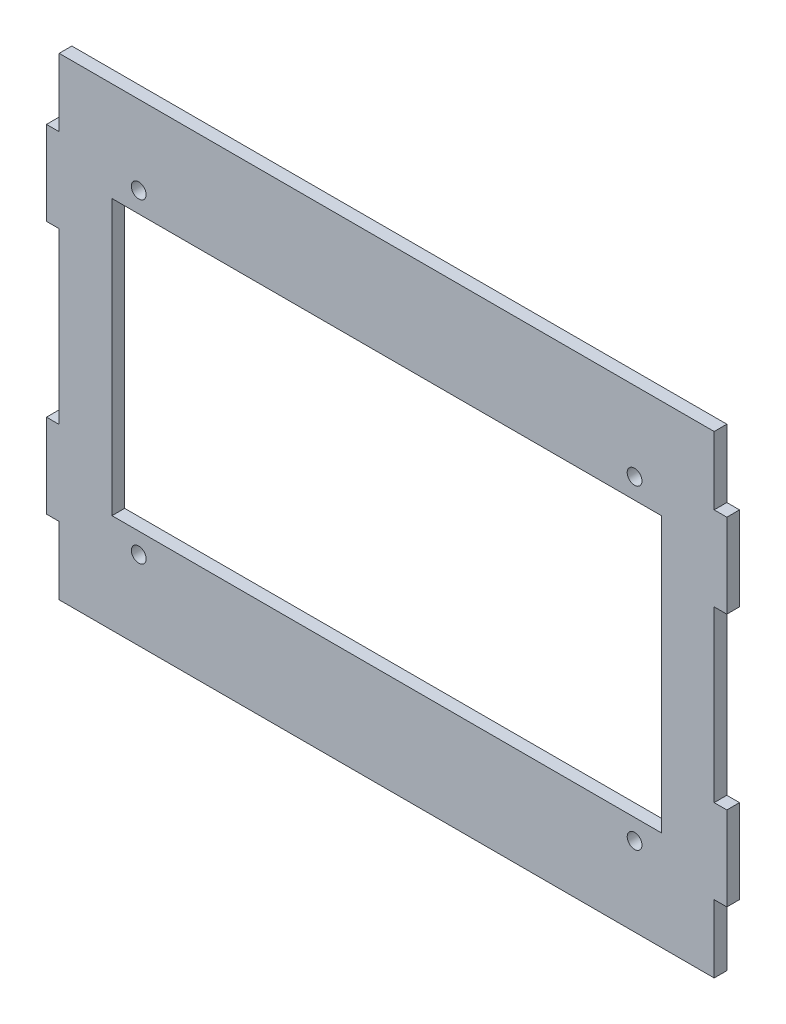
ISO-10303-21;
HEADER;
FILE_DESCRIPTION(('STEP AP214'),'2;1');
FILE_NAME('part.step','',(''),(''),'','','');
FILE_SCHEMA(('AUTOMOTIVE_DESIGN { 1 0 10303 214 1 1 1 1 }'));
ENDSEC;
DATA;
#1=APPLICATION_CONTEXT('core data for automotive mechanical design processes');
#2=APPLICATION_PROTOCOL_DEFINITION('international standard','automotive_design',2000,#1);
#3=PRODUCT_CONTEXT('',#1,'mechanical');
#4=PRODUCT('Part','Part','',(#3));
#5=PRODUCT_RELATED_PRODUCT_CATEGORY('part','',(#4));
#6=PRODUCT_DEFINITION_FORMATION('','',#4);
#7=PRODUCT_DEFINITION_CONTEXT('part definition',#1,'design');
#8=PRODUCT_DEFINITION('design','',#6,#7);
#9=PRODUCT_DEFINITION_SHAPE('','',#8);
#10=(LENGTH_UNIT() NAMED_UNIT(*) SI_UNIT(.MILLI.,.METRE.));
#11=(NAMED_UNIT(*) PLANE_ANGLE_UNIT() SI_UNIT($,.RADIAN.));
#12=(NAMED_UNIT(*) SI_UNIT($,.STERADIAN.) SOLID_ANGLE_UNIT());
#13=UNCERTAINTY_MEASURE_WITH_UNIT(LENGTH_MEASURE(1.E-05),#10,'distance_accuracy_value','');
#14=(GEOMETRIC_REPRESENTATION_CONTEXT(3) GLOBAL_UNCERTAINTY_ASSIGNED_CONTEXT((#13)) GLOBAL_UNIT_ASSIGNED_CONTEXT((#10,
#11,#12)) REPRESENTATION_CONTEXT('',''));
#15=CARTESIAN_POINT('',(0.,0.,0.));
#16=DIRECTION('',(0.,0.,1.));
#17=DIRECTION('',(1.,0.,0.));
#18=AXIS2_PLACEMENT_3D('',#15,#16,#17);
#19=CARTESIAN_POINT('',(139.990197314584,802.917760239699,3.));
#20=DIRECTION('',(1.,0.,0.));
#21=DIRECTION('',(0.,1.,0.));
#22=AXIS2_PLACEMENT_3D('',#19,#20,#21);
#23=PLANE('',#22);
#24=DIRECTION('',(0.,0.,-1.));
#25=VECTOR('',#24,1.);
#26=CARTESIAN_POINT('',(139.990197314584,786.857760239696,3.));
#27=LINE('',#26,#25);
#28=CARTESIAN_POINT('',(139.990197314584,786.857760239696,3.));
#29=VERTEX_POINT('',#28);
#30=CARTESIAN_POINT('',(139.990197314584,786.857760239696,0.));
#31=VERTEX_POINT('',#30);
#32=EDGE_CURVE('E56',#29,#31,#27,.T.);
#33=ORIENTED_EDGE('',*,*,#32,.F.);
#34=DIRECTION('',(0.,-1.,0.));
#35=VECTOR('',#34,1.);
#36=CARTESIAN_POINT('',(139.990197314584,802.917760239699,3.));
#37=LINE('',#36,#35);
#38=CARTESIAN_POINT('',(139.990197314584,802.917760239699,3.));
#39=VERTEX_POINT('',#38);
#40=EDGE_CURVE('E41',#39,#29,#37,.T.);
#41=ORIENTED_EDGE('',*,*,#40,.F.);
#42=DIRECTION('',(0.,0.,-1.));
#43=VECTOR('',#42,1.);
#44=CARTESIAN_POINT('',(139.990197314584,802.917760239699,3.));
#45=LINE('',#44,#43);
#46=CARTESIAN_POINT('',(139.990197314584,802.917760239699,0.));
#47=VERTEX_POINT('',#46);
#48=EDGE_CURVE('E11',#39,#47,#45,.T.);
#49=ORIENTED_EDGE('',*,*,#48,.T.);
#50=DIRECTION('',(0.,-1.,0.));
#51=VECTOR('',#50,1.);
#52=CARTESIAN_POINT('',(139.990197314584,802.917760239699,0.));
#53=LINE('',#52,#51);
#54=EDGE_CURVE('E398',#47,#31,#53,.T.);
#55=ORIENTED_EDGE('',*,*,#54,.T.);
#56=EDGE_LOOP('',(#33,#41,#49,#55));
#57=FACE_BOUND('',#56,.T.);
#58=ADVANCED_FACE('F33',(#57),#23,.F.);
#59=CARTESIAN_POINT('',(139.990197314584,766.977760239696,0.));
#60=VERTEX_POINT('',#59);
#61=CARTESIAN_POINT('',(139.990197314585,726.857760239702,0.));
#62=VERTEX_POINT('',#61);
#63=EDGE_CURVE('E400',#60,#62,#53,.T.);
#64=ORIENTED_EDGE('',*,*,#63,.T.);
#65=DIRECTION('',(0.,0.,-1.));
#66=VECTOR('',#65,1.);
#67=CARTESIAN_POINT('',(139.990197314585,726.857760239702,3.));
#68=LINE('',#67,#66);
#69=CARTESIAN_POINT('',(139.990197314585,726.857760239702,3.));
#70=VERTEX_POINT('',#69);
#71=EDGE_CURVE('E267',#70,#62,#68,.T.);
#72=ORIENTED_EDGE('',*,*,#71,.F.);
#73=CARTESIAN_POINT('',(139.990197314584,766.977760239696,3.));
#74=VERTEX_POINT('',#73);
#75=EDGE_CURVE('E48',#74,#70,#37,.T.);
#76=ORIENTED_EDGE('',*,*,#75,.F.);
#77=DIRECTION('',(0.,0.,-1.));
#78=VECTOR('',#77,1.);
#79=CARTESIAN_POINT('',(139.990197314584,766.977760239696,3.));
#80=LINE('',#79,#78);
#81=EDGE_CURVE('E370',#74,#60,#80,.T.);
#82=ORIENTED_EDGE('',*,*,#81,.T.);
#83=EDGE_LOOP('',(#64,#72,#76,#82));
#84=FACE_BOUND('',#83,.T.);
#85=ADVANCED_FACE('F403',(#84),#23,.F.);
#86=CARTESIAN_POINT('',(-746.152134466741,375.855698627133,3.));
#87=DIRECTION('',(0.,0.,-1.));
#88=DIRECTION('',(-0.866025403784439,0.499999999999999,0.));
#89=AXIS2_PLACEMENT_3D('',#86,#87,#88);
#90=PLANE('',#89);
#91=ORIENTED_EDGE('',*,*,#75,.T.);
#92=DIRECTION('',(1.,0.,0.));
#93=VECTOR('',#92,1.);
#94=CARTESIAN_POINT('',(136.990197314584,726.857760239702,3.));
#95=LINE('',#94,#93);
#96=CARTESIAN_POINT('',(136.990197314584,726.857760239702,3.));
#97=VERTEX_POINT('',#96);
#98=EDGE_CURVE('E264',#97,#70,#95,.T.);
#99=ORIENTED_EDGE('',*,*,#98,.F.);
#100=DIRECTION('',(0.,1.,0.));
#101=VECTOR('',#100,1.);
#102=CARTESIAN_POINT('',(136.990197314585,706.977760239702,3.));
#103=LINE('',#102,#101);
#104=CARTESIAN_POINT('',(136.990197314585,706.977760239702,3.));
#105=VERTEX_POINT('',#104);
#106=EDGE_CURVE('E260',#105,#97,#103,.T.);
#107=ORIENTED_EDGE('',*,*,#106,.F.);
#108=DIRECTION('',(-1.,0.,0.));
#109=VECTOR('',#108,1.);
#110=CARTESIAN_POINT('',(139.990197314585,706.977760239702,3.));
#111=LINE('',#110,#109);
#112=CARTESIAN_POINT('',(139.990197314585,706.977760239702,3.));
#113=VERTEX_POINT('',#112);
#114=EDGE_CURVE('E257',#113,#105,#111,.T.);
#115=ORIENTED_EDGE('',*,*,#114,.F.);
#116=DIRECTION('',(0.,1.,0.));
#117=VECTOR('',#116,1.);
#118=CARTESIAN_POINT('',(139.990197314585,690.917760239699,3.));
#119=LINE('',#118,#117);
#120=CARTESIAN_POINT('',(139.990197314585,690.917760239699,3.));
#121=VERTEX_POINT('',#120);
#122=EDGE_CURVE('E296',#121,#113,#119,.T.);
#123=ORIENTED_EDGE('',*,*,#122,.F.);
#124=DIRECTION('',(-1.,0.,0.));
#125=VECTOR('',#124,1.);
#126=CARTESIAN_POINT('',(139.990197314585,690.917760239699,3.));
#127=LINE('',#126,#125);
#128=CARTESIAN_POINT('',(294.990197314585,690.917760239699,3.));
#129=VERTEX_POINT('',#128);
#130=EDGE_CURVE('E294',#129,#121,#127,.T.);
#131=ORIENTED_EDGE('',*,*,#130,.F.);
#132=DIRECTION('',(0.,1.,0.));
#133=VECTOR('',#132,1.);
#134=CARTESIAN_POINT('',(294.990197314585,690.917760239699,3.));
#135=LINE('',#134,#133);
#136=CARTESIAN_POINT('',(294.990197314585,706.977760239702,3.));
#137=VERTEX_POINT('',#136);
#138=EDGE_CURVE('E222',#129,#137,#135,.T.);
#139=ORIENTED_EDGE('',*,*,#138,.T.);
#140=DIRECTION('',(1.,0.,0.));
#141=VECTOR('',#140,1.);
#142=CARTESIAN_POINT('',(294.990197314585,706.977760239702,3.));
#143=LINE('',#142,#141);
#144=CARTESIAN_POINT('',(297.990197314584,706.977760239702,3.));
#145=VERTEX_POINT('',#144);
#146=EDGE_CURVE('E200',#137,#145,#143,.T.);
#147=ORIENTED_EDGE('',*,*,#146,.T.);
#148=DIRECTION('',(0.,1.,0.));
#149=VECTOR('',#148,1.);
#150=CARTESIAN_POINT('',(297.990197314584,706.977760239702,3.));
#151=LINE('',#150,#149);
#152=CARTESIAN_POINT('',(297.990197314584,726.857760239702,3.));
#153=VERTEX_POINT('',#152);
#154=EDGE_CURVE('E211',#145,#153,#151,.T.);
#155=ORIENTED_EDGE('',*,*,#154,.T.);
#156=DIRECTION('',(-1.,0.,0.));
#157=VECTOR('',#156,1.);
#158=CARTESIAN_POINT('',(297.990197314584,726.857760239702,3.));
#159=LINE('',#158,#157);
#160=CARTESIAN_POINT('',(294.990197314585,726.857760239703,3.));
#161=VERTEX_POINT('',#160);
#162=EDGE_CURVE('E216',#153,#161,#159,.T.);
#163=ORIENTED_EDGE('',*,*,#162,.T.);
#164=DIRECTION('',(0.,-1.,0.));
#165=VECTOR('',#164,1.);
#166=CARTESIAN_POINT('',(294.990197314584,802.9177602397,3.));
#167=LINE('',#166,#165);
#168=CARTESIAN_POINT('',(294.990197314584,766.977760239696,3.));
#169=VERTEX_POINT('',#168);
#170=EDGE_CURVE('E350',#169,#161,#167,.T.);
#171=ORIENTED_EDGE('',*,*,#170,.F.);
#172=DIRECTION('',(-1.,0.,0.));
#173=VECTOR('',#172,1.);
#174=CARTESIAN_POINT('',(297.990197314584,766.977760239697,3.));
#175=LINE('',#174,#173);
#176=CARTESIAN_POINT('',(297.990197314584,766.977760239697,3.));
#177=VERTEX_POINT('',#176);
#178=EDGE_CURVE('E320',#177,#169,#175,.T.);
#179=ORIENTED_EDGE('',*,*,#178,.F.);
#180=DIRECTION('',(0.,-1.,0.));
#181=VECTOR('',#180,1.);
#182=CARTESIAN_POINT('',(297.990197314584,786.857760239697,3.));
#183=LINE('',#182,#181);
#184=CARTESIAN_POINT('',(297.990197314584,786.857760239697,3.));
#185=VERTEX_POINT('',#184);
#186=EDGE_CURVE('E316',#185,#177,#183,.T.);
#187=ORIENTED_EDGE('',*,*,#186,.F.);
#188=DIRECTION('',(1.,0.,0.));
#189=VECTOR('',#188,1.);
#190=CARTESIAN_POINT('',(294.990197314584,786.857760239697,3.));
#191=LINE('',#190,#189);
#192=CARTESIAN_POINT('',(294.990197314584,786.857760239697,3.));
#193=VERTEX_POINT('',#192);
#194=EDGE_CURVE('E313',#193,#185,#191,.T.);
#195=ORIENTED_EDGE('',*,*,#194,.F.);
#196=CARTESIAN_POINT('',(294.990197314584,802.9177602397,3.));
#197=VERTEX_POINT('',#196);
#198=EDGE_CURVE('E346',#197,#193,#167,.T.);
#199=ORIENTED_EDGE('',*,*,#198,.F.);
#200=DIRECTION('',(-1.,0.,0.));
#201=VECTOR('',#200,1.);
#202=CARTESIAN_POINT('',(139.990197314584,802.917760239699,3.));
#203=LINE('',#202,#201);
#204=EDGE_CURVE('E396',#197,#39,#203,.T.);
#205=ORIENTED_EDGE('',*,*,#204,.T.);
#206=ORIENTED_EDGE('',*,*,#40,.T.);
#207=DIRECTION('',(-1.,0.,0.));
#208=VECTOR('',#207,1.);
#209=CARTESIAN_POINT('',(139.990197314584,786.857760239696,3.));
#210=LINE('',#209,#208);
#211=CARTESIAN_POINT('',(136.990197314584,786.857760239696,3.));
#212=VERTEX_POINT('',#211);
#213=EDGE_CURVE('E363',#29,#212,#210,.T.);
#214=ORIENTED_EDGE('',*,*,#213,.T.);
#215=DIRECTION('',(0.,-1.,0.));
#216=VECTOR('',#215,1.);
#217=CARTESIAN_POINT('',(136.990197314584,786.857760239696,3.));
#218=LINE('',#217,#216);
#219=CARTESIAN_POINT('',(136.990197314584,766.977760239696,3.));
#220=VERTEX_POINT('',#219);
#221=EDGE_CURVE('E365',#212,#220,#218,.T.);
#222=ORIENTED_EDGE('',*,*,#221,.T.);
#223=DIRECTION('',(1.,0.,0.));
#224=VECTOR('',#223,1.);
#225=CARTESIAN_POINT('',(136.990197314584,766.977760239696,3.));
#226=LINE('',#225,#224);
#227=EDGE_CURVE('E368',#220,#74,#226,.T.);
#228=ORIENTED_EDGE('',*,*,#227,.T.);
#229=EDGE_LOOP('',(#91,#99,#107,#115,#123,#131,#139,#147,#155,#163,#171,#179,#187,#195,#199,
#205,#206,#214,#222,#228));
#230=FACE_BOUND('',#229,.T.);
#231=CARTESIAN_POINT('',(158.820197314584,784.232760239699,3.));
#232=DIRECTION('',(0.,0.,1.));
#233=DIRECTION('',(0.866025403784439,-0.499999999999999,0.));
#234=AXIS2_PLACEMENT_3D('',#231,#232,#233);
#235=CIRCLE('',#234,1.75);
#236=CARTESIAN_POINT('',(160.335741771207,783.357760239699,3.));
#237=VERTEX_POINT('',#236);
#238=EDGE_CURVE('E356',#237,#237,#235,.T.);
#239=ORIENTED_EDGE('',*,*,#238,.F.);
#240=EDGE_LOOP('',(#239));
#241=FACE_BOUND('',#240,.T.);
#242=DIRECTION('',(-1.,0.,0.));
#243=VECTOR('',#242,1.);
#244=CARTESIAN_POINT('',(152.490197314585,714.417760239699,3.));
#245=LINE('',#244,#243);
#246=CARTESIAN_POINT('',(282.490197314584,714.417760239699,3.));
#247=VERTEX_POINT('',#246);
#248=CARTESIAN_POINT('',(152.490197314585,714.417760239699,3.));
#249=VERTEX_POINT('',#248);
#250=EDGE_CURVE('E285',#247,#249,#245,.T.);
#251=ORIENTED_EDGE('',*,*,#250,.T.);
#252=DIRECTION('',(0.,-1.,0.));
#253=VECTOR('',#252,1.);
#254=CARTESIAN_POINT('',(152.490197314584,714.417760239699,3.));
#255=LINE('',#254,#253);
#256=CARTESIAN_POINT('',(152.490197314584,779.417760239699,3.));
#257=VERTEX_POINT('',#256);
#258=EDGE_CURVE('E387',#257,#249,#255,.T.);
#259=ORIENTED_EDGE('',*,*,#258,.F.);
#260=DIRECTION('',(-1.,0.,0.));
#261=VECTOR('',#260,1.);
#262=CARTESIAN_POINT('',(152.490197314584,779.417760239699,3.));
#263=LINE('',#262,#261);
#264=CARTESIAN_POINT('',(282.490197314584,779.4177602397,3.));
#265=VERTEX_POINT('',#264);
#266=EDGE_CURVE('E385',#265,#257,#263,.T.);
#267=ORIENTED_EDGE('',*,*,#266,.F.);
#268=DIRECTION('',(0.,-1.,0.));
#269=VECTOR('',#268,1.);
#270=CARTESIAN_POINT('',(282.490197314584,714.417760239699,3.));
#271=LINE('',#270,#269);
#272=EDGE_CURVE('E339',#265,#247,#271,.T.);
#273=ORIENTED_EDGE('',*,*,#272,.T.);
#274=EDGE_LOOP('',(#251,#259,#267,#273));
#275=FACE_BOUND('',#274,.T.);
#276=CARTESIAN_POINT('',(276.160197314584,784.232760239699,3.));
#277=DIRECTION('',(0.,0.,-1.));
#278=DIRECTION('',(-0.866025403784438,-0.500000000000002,0.));
#279=AXIS2_PLACEMENT_3D('',#276,#277,#278);
#280=CIRCLE('',#279,1.75);
#281=CARTESIAN_POINT('',(274.644652857961,783.357760239699,3.));
#282=VERTEX_POINT('',#281);
#283=EDGE_CURVE('E306',#282,#282,#280,.T.);
#284=ORIENTED_EDGE('',*,*,#283,.T.);
#285=EDGE_LOOP('',(#284));
#286=FACE_BOUND('',#285,.T.);
#287=CARTESIAN_POINT('',(158.820197314584,709.602760239699,3.));
#288=DIRECTION('',(0.,0.,-1.));
#289=DIRECTION('',(0.866025403784437,0.500000000000004,0.));
#290=AXIS2_PLACEMENT_3D('',#287,#288,#289);
#291=CIRCLE('',#290,1.75);
#292=CARTESIAN_POINT('',(160.335741771207,710.477760239699,3.));
#293=VERTEX_POINT('',#292);
#294=EDGE_CURVE('E250',#293,#293,#291,.T.);
#295=ORIENTED_EDGE('',*,*,#294,.T.);
#296=EDGE_LOOP('',(#295));
#297=FACE_BOUND('',#296,.T.);
#298=CARTESIAN_POINT('',(276.160197314585,709.602760239699,3.));
#299=DIRECTION('',(0.,0.,1.));
#300=DIRECTION('',(-0.86602540378444,0.499999999999997,0.));
#301=AXIS2_PLACEMENT_3D('',#298,#299,#300);
#302=CIRCLE('',#301,1.75);
#303=CARTESIAN_POINT('',(274.644652857962,710.477760239699,3.));
#304=VERTEX_POINT('',#303);
#305=EDGE_CURVE('E229',#304,#304,#302,.T.);
#306=ORIENTED_EDGE('',*,*,#305,.F.);
#307=EDGE_LOOP('',(#306));
#308=FACE_BOUND('',#307,.T.);
#309=ADVANCED_FACE('F218',(#230,#241,#275,#286,#297,#308),#90,.F.);
#310=CARTESIAN_POINT('',(-746.152134466741,375.855698627133,0.));
#311=DIRECTION('',(0.,0.,-1.));
#312=DIRECTION('',(-0.866025403784439,0.499999999999999,0.));
#313=AXIS2_PLACEMENT_3D('',#310,#311,#312);
#314=PLANE('',#313);
#315=DIRECTION('',(1.,0.,0.));
#316=VECTOR('',#315,1.);
#317=CARTESIAN_POINT('',(136.990197314584,726.857760239702,0.));
#318=LINE('',#317,#316);
#319=CARTESIAN_POINT('',(136.990197314584,726.857760239702,0.));
#320=VERTEX_POINT('',#319);
#321=EDGE_CURVE('E261',#320,#62,#318,.T.);
#322=ORIENTED_EDGE('',*,*,#321,.T.);
#323=ORIENTED_EDGE('',*,*,#63,.F.);
#324=DIRECTION('',(1.,0.,0.));
#325=VECTOR('',#324,1.);
#326=CARTESIAN_POINT('',(136.990197314584,766.977760239696,0.));
#327=LINE('',#326,#325);
#328=CARTESIAN_POINT('',(136.990197314584,766.977760239696,0.));
#329=VERTEX_POINT('',#328);
#330=EDGE_CURVE('E366',#329,#60,#327,.T.);
#331=ORIENTED_EDGE('',*,*,#330,.F.);
#332=DIRECTION('',(0.,-1.,0.));
#333=VECTOR('',#332,1.);
#334=CARTESIAN_POINT('',(136.990197314584,786.857760239696,0.));
#335=LINE('',#334,#333);
#336=CARTESIAN_POINT('',(136.990197314584,786.857760239696,0.));
#337=VERTEX_POINT('',#336);
#338=EDGE_CURVE('E372',#337,#329,#335,.T.);
#339=ORIENTED_EDGE('',*,*,#338,.F.);
#340=DIRECTION('',(-1.,0.,0.));
#341=VECTOR('',#340,1.);
#342=CARTESIAN_POINT('',(139.990197314584,786.857760239696,0.));
#343=LINE('',#342,#341);
#344=EDGE_CURVE('E360',#31,#337,#343,.T.);
#345=ORIENTED_EDGE('',*,*,#344,.F.);
#346=ORIENTED_EDGE('',*,*,#54,.F.);
#347=DIRECTION('',(-1.,0.,0.));
#348=VECTOR('',#347,1.);
#349=CARTESIAN_POINT('',(139.990197314584,802.917760239699,0.));
#350=LINE('',#349,#348);
#351=CARTESIAN_POINT('',(294.990197314584,802.9177602397,0.));
#352=VERTEX_POINT('',#351);
#353=EDGE_CURVE('E395',#352,#47,#350,.T.);
#354=ORIENTED_EDGE('',*,*,#353,.F.);
#355=DIRECTION('',(0.,-1.,0.));
#356=VECTOR('',#355,1.);
#357=CARTESIAN_POINT('',(294.990197314584,802.9177602397,0.));
#358=LINE('',#357,#356);
#359=CARTESIAN_POINT('',(294.990197314584,786.857760239697,0.));
#360=VERTEX_POINT('',#359);
#361=EDGE_CURVE('E351',#352,#360,#358,.T.);
#362=ORIENTED_EDGE('',*,*,#361,.T.);
#363=DIRECTION('',(1.,0.,0.));
#364=VECTOR('',#363,1.);
#365=CARTESIAN_POINT('',(294.990197314584,786.857760239697,0.));
#366=LINE('',#365,#364);
#367=CARTESIAN_POINT('',(297.990197314584,786.857760239697,0.));
#368=VERTEX_POINT('',#367);
#369=EDGE_CURVE('E310',#360,#368,#366,.T.);
#370=ORIENTED_EDGE('',*,*,#369,.T.);
#371=DIRECTION('',(0.,-1.,0.));
#372=VECTOR('',#371,1.);
#373=CARTESIAN_POINT('',(297.990197314584,786.857760239697,0.));
#374=LINE('',#373,#372);
#375=CARTESIAN_POINT('',(297.990197314584,766.977760239697,0.));
#376=VERTEX_POINT('',#375);
#377=EDGE_CURVE('E325',#368,#376,#374,.T.);
#378=ORIENTED_EDGE('',*,*,#377,.T.);
#379=DIRECTION('',(-1.,0.,0.));
#380=VECTOR('',#379,1.);
#381=CARTESIAN_POINT('',(297.990197314584,766.977760239697,0.));
#382=LINE('',#381,#380);
#383=CARTESIAN_POINT('',(294.990197314584,766.977760239697,0.));
#384=VERTEX_POINT('',#383);
#385=EDGE_CURVE('E317',#376,#384,#382,.T.);
#386=ORIENTED_EDGE('',*,*,#385,.T.);
#387=CARTESIAN_POINT('',(294.990197314585,726.857760239702,0.));
#388=VERTEX_POINT('',#387);
#389=EDGE_CURVE('E345',#384,#388,#358,.T.);
#390=ORIENTED_EDGE('',*,*,#389,.T.);
#391=DIRECTION('',(-1.,0.,0.));
#392=VECTOR('',#391,1.);
#393=CARTESIAN_POINT('',(297.990197314584,726.857760239702,0.));
#394=LINE('',#393,#392);
#395=CARTESIAN_POINT('',(297.990197314584,726.857760239702,0.));
#396=VERTEX_POINT('',#395);
#397=EDGE_CURVE('E223',#396,#388,#394,.T.);
#398=ORIENTED_EDGE('',*,*,#397,.F.);
#399=DIRECTION('',(0.,1.,0.));
#400=VECTOR('',#399,1.);
#401=CARTESIAN_POINT('',(297.990197314584,706.977760239702,0.));
#402=LINE('',#401,#400);
#403=CARTESIAN_POINT('',(297.990197314584,706.977760239702,0.));
#404=VERTEX_POINT('',#403);
#405=EDGE_CURVE('E226',#404,#396,#402,.T.);
#406=ORIENTED_EDGE('',*,*,#405,.F.);
#407=DIRECTION('',(1.,0.,0.));
#408=VECTOR('',#407,1.);
#409=CARTESIAN_POINT('',(294.990197314585,706.977760239702,0.));
#410=LINE('',#409,#408);
#411=CARTESIAN_POINT('',(294.990197314585,706.977760239702,0.));
#412=VERTEX_POINT('',#411);
#413=EDGE_CURVE('E203',#412,#404,#410,.T.);
#414=ORIENTED_EDGE('',*,*,#413,.F.);
#415=DIRECTION('',(0.,1.,0.));
#416=VECTOR('',#415,1.);
#417=CARTESIAN_POINT('',(294.990197314585,690.917760239699,0.));
#418=LINE('',#417,#416);
#419=CARTESIAN_POINT('',(294.990197314585,690.917760239699,0.));
#420=VERTEX_POINT('',#419);
#421=EDGE_CURVE('E244',#420,#412,#418,.T.);
#422=ORIENTED_EDGE('',*,*,#421,.F.);
#423=DIRECTION('',(-1.,0.,0.));
#424=VECTOR('',#423,1.);
#425=CARTESIAN_POINT('',(139.990197314585,690.917760239699,0.));
#426=LINE('',#425,#424);
#427=CARTESIAN_POINT('',(139.990197314585,690.917760239699,0.));
#428=VERTEX_POINT('',#427);
#429=EDGE_CURVE('E293',#420,#428,#426,.T.);
#430=ORIENTED_EDGE('',*,*,#429,.T.);
#431=DIRECTION('',(0.,1.,0.));
#432=VECTOR('',#431,1.);
#433=CARTESIAN_POINT('',(139.990197314585,690.917760239699,0.));
#434=LINE('',#433,#432);
#435=CARTESIAN_POINT('',(139.990197314585,706.977760239702,0.));
#436=VERTEX_POINT('',#435);
#437=EDGE_CURVE('E297',#428,#436,#434,.T.);
#438=ORIENTED_EDGE('',*,*,#437,.T.);
#439=DIRECTION('',(-1.,0.,0.));
#440=VECTOR('',#439,1.);
#441=CARTESIAN_POINT('',(139.990197314585,706.977760239702,0.));
#442=LINE('',#441,#440);
#443=CARTESIAN_POINT('',(136.990197314585,706.977760239702,0.));
#444=VERTEX_POINT('',#443);
#445=EDGE_CURVE('E254',#436,#444,#442,.T.);
#446=ORIENTED_EDGE('',*,*,#445,.T.);
#447=DIRECTION('',(0.,1.,0.));
#448=VECTOR('',#447,1.);
#449=CARTESIAN_POINT('',(136.990197314585,706.977760239702,0.));
#450=LINE('',#449,#448);
#451=EDGE_CURVE('E270',#444,#320,#450,.T.);
#452=ORIENTED_EDGE('',*,*,#451,.T.);
#453=EDGE_LOOP('',(#322,#323,#331,#339,#345,#346,#354,#362,#370,#378,#386,#390,#398,#406,#414,
#422,#430,#438,#446,#452));
#454=FACE_BOUND('',#453,.T.);
#455=CARTESIAN_POINT('',(158.820197314584,784.232760239699,0.));
#456=DIRECTION('',(0.,0.,1.));
#457=DIRECTION('',(0.866025403784439,-0.499999999999999,0.));
#458=AXIS2_PLACEMENT_3D('',#455,#456,#457);
#459=CIRCLE('',#458,1.75);
#460=CARTESIAN_POINT('',(160.335741771207,783.357760239699,0.));
#461=VERTEX_POINT('',#460);
#462=EDGE_CURVE('E357',#461,#461,#459,.T.);
#463=ORIENTED_EDGE('',*,*,#462,.T.);
#464=EDGE_LOOP('',(#463));
#465=FACE_BOUND('',#464,.T.);
#466=DIRECTION('',(0.,-1.,0.));
#467=VECTOR('',#466,1.);
#468=CARTESIAN_POINT('',(152.490197314584,714.417760239699,0.));
#469=LINE('',#468,#467);
#470=CARTESIAN_POINT('',(152.490197314584,779.417760239699,0.));
#471=VERTEX_POINT('',#470);
#472=CARTESIAN_POINT('',(152.490197314585,714.417760239699,0.));
#473=VERTEX_POINT('',#472);
#474=EDGE_CURVE('E388',#471,#473,#469,.T.);
#475=ORIENTED_EDGE('',*,*,#474,.T.);
#476=DIRECTION('',(-1.,0.,0.));
#477=VECTOR('',#476,1.);
#478=CARTESIAN_POINT('',(152.490197314585,714.417760239699,0.));
#479=LINE('',#478,#477);
#480=CARTESIAN_POINT('',(282.490197314584,714.417760239699,0.));
#481=VERTEX_POINT('',#480);
#482=EDGE_CURVE('E284',#481,#473,#479,.T.);
#483=ORIENTED_EDGE('',*,*,#482,.F.);
#484=DIRECTION('',(0.,-1.,0.));
#485=VECTOR('',#484,1.);
#486=CARTESIAN_POINT('',(282.490197314584,714.417760239699,0.));
#487=LINE('',#486,#485);
#488=CARTESIAN_POINT('',(282.490197314584,779.4177602397,0.));
#489=VERTEX_POINT('',#488);
#490=EDGE_CURVE('E338',#489,#481,#487,.T.);
#491=ORIENTED_EDGE('',*,*,#490,.F.);
#492=DIRECTION('',(-1.,0.,0.));
#493=VECTOR('',#492,1.);
#494=CARTESIAN_POINT('',(152.490197314584,779.417760239699,0.));
#495=LINE('',#494,#493);
#496=EDGE_CURVE('E384',#489,#471,#495,.T.);
#497=ORIENTED_EDGE('',*,*,#496,.T.);
#498=EDGE_LOOP('',(#475,#483,#491,#497));
#499=FACE_BOUND('',#498,.T.);
#500=CARTESIAN_POINT('',(276.160197314584,784.232760239699,0.));
#501=DIRECTION('',(0.,0.,-1.));
#502=DIRECTION('',(-0.866025403784438,-0.500000000000002,0.));
#503=AXIS2_PLACEMENT_3D('',#500,#501,#502);
#504=CIRCLE('',#503,1.75);
#505=CARTESIAN_POINT('',(274.644652857961,783.357760239699,0.));
#506=VERTEX_POINT('',#505);
#507=EDGE_CURVE('E307',#506,#506,#504,.T.);
#508=ORIENTED_EDGE('',*,*,#507,.F.);
#509=EDGE_LOOP('',(#508));
#510=FACE_BOUND('',#509,.T.);
#511=CARTESIAN_POINT('',(158.820197314584,709.602760239699,0.));
#512=DIRECTION('',(0.,0.,-1.));
#513=DIRECTION('',(0.866025403784437,0.500000000000004,0.));
#514=AXIS2_PLACEMENT_3D('',#511,#512,#513);
#515=CIRCLE('',#514,1.75);
#516=CARTESIAN_POINT('',(160.335741771207,710.477760239699,0.));
#517=VERTEX_POINT('',#516);
#518=EDGE_CURVE('E251',#517,#517,#515,.T.);
#519=ORIENTED_EDGE('',*,*,#518,.F.);
#520=EDGE_LOOP('',(#519));
#521=FACE_BOUND('',#520,.T.);
#522=CARTESIAN_POINT('',(276.160197314585,709.602760239699,0.));
#523=DIRECTION('',(0.,0.,1.));
#524=DIRECTION('',(-0.86602540378444,0.499999999999997,0.));
#525=AXIS2_PLACEMENT_3D('',#522,#523,#524);
#526=CIRCLE('',#525,1.75);
#527=CARTESIAN_POINT('',(274.644652857962,710.477760239699,0.));
#528=VERTEX_POINT('',#527);
#529=EDGE_CURVE('E235',#528,#528,#526,.T.);
#530=ORIENTED_EDGE('',*,*,#529,.T.);
#531=EDGE_LOOP('',(#530));
#532=FACE_BOUND('',#531,.T.);
#533=ADVANCED_FACE('F408',(#454,#465,#499,#510,#521,#532),#314,.T.);
#534=CARTESIAN_POINT('',(139.990197314584,802.917760239699,3.));
#535=DIRECTION('',(0.,-1.,0.));
#536=DIRECTION('',(1.,0.,0.));
#537=AXIS2_PLACEMENT_3D('',#534,#535,#536);
#538=PLANE('',#537);
#539=ORIENTED_EDGE('',*,*,#204,.F.);
#540=DIRECTION('',(0.,0.,-1.));
#541=VECTOR('',#540,1.);
#542=CARTESIAN_POINT('',(294.990197314584,802.9177602397,3.));
#543=LINE('',#542,#541);
#544=EDGE_CURVE('E349',#197,#352,#543,.T.);
#545=ORIENTED_EDGE('',*,*,#544,.T.);
#546=ORIENTED_EDGE('',*,*,#353,.T.);
#547=ORIENTED_EDGE('',*,*,#48,.F.);
#548=EDGE_LOOP('',(#539,#545,#546,#547));
#549=FACE_BOUND('',#548,.T.);
#550=ADVANCED_FACE('F35',(#549),#538,.F.);
#551=CARTESIAN_POINT('',(152.490197314584,779.417760239699,3.));
#552=DIRECTION('',(0.,-1.,0.));
#553=DIRECTION('',(1.,0.,0.));
#554=AXIS2_PLACEMENT_3D('',#551,#552,#553);
#555=PLANE('',#554);
#556=ORIENTED_EDGE('',*,*,#496,.F.);
#557=DIRECTION('',(0.,0.,-1.));
#558=VECTOR('',#557,1.);
#559=CARTESIAN_POINT('',(282.490197314584,779.4177602397,3.));
#560=LINE('',#559,#558);
#561=EDGE_CURVE('E341',#265,#489,#560,.T.);
#562=ORIENTED_EDGE('',*,*,#561,.F.);
#563=ORIENTED_EDGE('',*,*,#266,.T.);
#564=DIRECTION('',(0.,0.,-1.));
#565=VECTOR('',#564,1.);
#566=CARTESIAN_POINT('',(152.490197314584,779.417760239699,3.));
#567=LINE('',#566,#565);
#568=EDGE_CURVE('E390',#257,#471,#567,.T.);
#569=ORIENTED_EDGE('',*,*,#568,.T.);
#570=EDGE_LOOP('',(#556,#562,#563,#569));
#571=FACE_BOUND('',#570,.T.);
#572=ADVANCED_FACE('F489',(#571),#555,.T.);
#573=CARTESIAN_POINT('',(152.490197314584,714.417760239699,3.));
#574=DIRECTION('',(1.,0.,0.));
#575=DIRECTION('',(0.,1.,0.));
#576=AXIS2_PLACEMENT_3D('',#573,#574,#575);
#577=PLANE('',#576);
#578=ORIENTED_EDGE('',*,*,#258,.T.);
#579=DIRECTION('',(0.,0.,-1.));
#580=VECTOR('',#579,1.);
#581=CARTESIAN_POINT('',(152.490197314585,714.417760239699,3.));
#582=LINE('',#581,#580);
#583=EDGE_CURVE('E288',#249,#473,#582,.T.);
#584=ORIENTED_EDGE('',*,*,#583,.T.);
#585=ORIENTED_EDGE('',*,*,#474,.F.);
#586=ORIENTED_EDGE('',*,*,#568,.F.);
#587=EDGE_LOOP('',(#578,#584,#585,#586));
#588=FACE_BOUND('',#587,.T.);
#589=ADVANCED_FACE('F492',(#588),#577,.T.);
#590=CARTESIAN_POINT('',(139.990197314584,786.857760239696,3.));
#591=DIRECTION('',(0.,-1.,0.));
#592=DIRECTION('',(1.,0.,0.));
#593=AXIS2_PLACEMENT_3D('',#590,#591,#592);
#594=PLANE('',#593);
#595=ORIENTED_EDGE('',*,*,#344,.T.);
#596=DIRECTION('',(0.,0.,-1.));
#597=VECTOR('',#596,1.);
#598=CARTESIAN_POINT('',(136.990197314584,786.857760239696,3.));
#599=LINE('',#598,#597);
#600=EDGE_CURVE('E380',#212,#337,#599,.T.);
#601=ORIENTED_EDGE('',*,*,#600,.F.);
#602=ORIENTED_EDGE('',*,*,#213,.F.);
#603=ORIENTED_EDGE('',*,*,#32,.T.);
#604=EDGE_LOOP('',(#595,#601,#602,#603));
#605=FACE_BOUND('',#604,.T.);
#606=ADVANCED_FACE('F426',(#605),#594,.F.);
#607=CARTESIAN_POINT('',(136.990197314584,786.857760239696,3.));
#608=DIRECTION('',(1.,0.,0.));
#609=DIRECTION('',(0.,1.,0.));
#610=AXIS2_PLACEMENT_3D('',#607,#608,#609);
#611=PLANE('',#610);
#612=ORIENTED_EDGE('',*,*,#338,.T.);
#613=DIRECTION('',(0.,0.,-1.));
#614=VECTOR('',#613,1.);
#615=CARTESIAN_POINT('',(136.990197314584,766.977760239696,3.));
#616=LINE('',#615,#614);
#617=EDGE_CURVE('E377',#220,#329,#616,.T.);
#618=ORIENTED_EDGE('',*,*,#617,.F.);
#619=ORIENTED_EDGE('',*,*,#221,.F.);
#620=ORIENTED_EDGE('',*,*,#600,.T.);
#621=EDGE_LOOP('',(#612,#618,#619,#620));
#622=FACE_BOUND('',#621,.T.);
#623=ADVANCED_FACE('F422',(#622),#611,.F.);
#624=CARTESIAN_POINT('',(136.990197314584,766.977760239696,3.));
#625=DIRECTION('',(0.,1.,0.));
#626=DIRECTION('',(-1.,0.,0.));
#627=AXIS2_PLACEMENT_3D('',#624,#625,#626);
#628=PLANE('',#627);
#629=ORIENTED_EDGE('',*,*,#330,.T.);
#630=ORIENTED_EDGE('',*,*,#81,.F.);
#631=ORIENTED_EDGE('',*,*,#227,.F.);
#632=ORIENTED_EDGE('',*,*,#617,.T.);
#633=EDGE_LOOP('',(#629,#630,#631,#632));
#634=FACE_BOUND('',#633,.T.);
#635=ADVANCED_FACE('F419',(#634),#628,.F.);
#636=CARTESIAN_POINT('',(158.820197314584,784.232760239699,0.));
#637=DIRECTION('',(0.,0.,1.));
#638=DIRECTION('',(0.866025403784439,-0.499999999999999,0.));
#639=AXIS2_PLACEMENT_3D('',#636,#637,#638);
#640=CYLINDRICAL_SURFACE('',#639,1.75);
#641=ORIENTED_EDGE('',*,*,#462,.F.);
#642=EDGE_LOOP('',(#641));
#643=FACE_BOUND('',#642,.T.);
#644=ORIENTED_EDGE('',*,*,#238,.T.);
#645=EDGE_LOOP('',(#644));
#646=FACE_BOUND('',#645,.T.);
#647=ADVANCED_FACE('F503',(#643,#646),#640,.F.);
#648=CARTESIAN_POINT('',(294.990197314584,802.9177602397,3.));
#649=DIRECTION('',(-1.,0.,0.));
#650=DIRECTION('',(0.,1.,0.));
#651=AXIS2_PLACEMENT_3D('',#648,#649,#650);
#652=PLANE('',#651);
#653=DIRECTION('',(0.,0.,-1.));
#654=VECTOR('',#653,1.);
#655=CARTESIAN_POINT('',(294.990197314584,786.857760239697,3.));
#656=LINE('',#655,#654);
#657=EDGE_CURVE('E335',#193,#360,#656,.T.);
#658=ORIENTED_EDGE('',*,*,#657,.T.);
#659=ORIENTED_EDGE('',*,*,#361,.F.);
#660=ORIENTED_EDGE('',*,*,#544,.F.);
#661=ORIENTED_EDGE('',*,*,#198,.T.);
#662=EDGE_LOOP('',(#658,#659,#660,#661));
#663=FACE_BOUND('',#662,.T.);
#664=ADVANCED_FACE('F434',(#663),#652,.F.);
#665=ORIENTED_EDGE('',*,*,#389,.F.);
#666=DIRECTION('',(0.,0.,-1.));
#667=VECTOR('',#666,1.);
#668=CARTESIAN_POINT('',(294.990197314584,766.977760239697,3.));
#669=LINE('',#668,#667);
#670=EDGE_CURVE('E322',#169,#384,#669,.T.);
#671=ORIENTED_EDGE('',*,*,#670,.F.);
#672=ORIENTED_EDGE('',*,*,#170,.T.);
#673=DIRECTION('',(0.,0.,-1.));
#674=VECTOR('',#673,1.);
#675=CARTESIAN_POINT('',(294.990197314585,726.857760239702,3.));
#676=LINE('',#675,#674);
#677=EDGE_CURVE('E233',#161,#388,#676,.T.);
#678=ORIENTED_EDGE('',*,*,#677,.T.);
#679=EDGE_LOOP('',(#665,#671,#672,#678));
#680=FACE_BOUND('',#679,.T.);
#681=ADVANCED_FACE('F450',(#680),#652,.F.);
#682=CARTESIAN_POINT('',(282.490197314584,714.417760239699,3.));
#683=DIRECTION('',(-1.,0.,0.));
#684=DIRECTION('',(0.,1.,0.));
#685=AXIS2_PLACEMENT_3D('',#682,#683,#684);
#686=PLANE('',#685);
#687=ORIENTED_EDGE('',*,*,#490,.T.);
#688=DIRECTION('',(0.,0.,-1.));
#689=VECTOR('',#688,1.);
#690=CARTESIAN_POINT('',(282.490197314584,714.417760239699,3.));
#691=LINE('',#690,#689);
#692=EDGE_CURVE('E241',#247,#481,#691,.T.);
#693=ORIENTED_EDGE('',*,*,#692,.F.);
#694=ORIENTED_EDGE('',*,*,#272,.F.);
#695=ORIENTED_EDGE('',*,*,#561,.T.);
#696=EDGE_LOOP('',(#687,#693,#694,#695));
#697=FACE_BOUND('',#696,.T.);
#698=ADVANCED_FACE('F509',(#697),#686,.T.);
#699=CARTESIAN_POINT('',(294.990197314584,786.857760239697,3.));
#700=DIRECTION('',(0.,-1.,0.));
#701=DIRECTION('',(-1.,0.,0.));
#702=AXIS2_PLACEMENT_3D('',#699,#700,#701);
#703=PLANE('',#702);
#704=ORIENTED_EDGE('',*,*,#369,.F.);
#705=ORIENTED_EDGE('',*,*,#657,.F.);
#706=ORIENTED_EDGE('',*,*,#194,.T.);
#707=DIRECTION('',(0.,0.,-1.));
#708=VECTOR('',#707,1.);
#709=CARTESIAN_POINT('',(297.990197314584,786.857760239697,3.));
#710=LINE('',#709,#708);
#711=EDGE_CURVE('E333',#185,#368,#710,.T.);
#712=ORIENTED_EDGE('',*,*,#711,.T.);
#713=EDGE_LOOP('',(#704,#705,#706,#712));
#714=FACE_BOUND('',#713,.T.);
#715=ADVANCED_FACE('F436',(#714),#703,.F.);
#716=CARTESIAN_POINT('',(297.990197314584,786.857760239697,3.));
#717=DIRECTION('',(-1.,0.,0.));
#718=DIRECTION('',(0.,1.,0.));
#719=AXIS2_PLACEMENT_3D('',#716,#717,#718);
#720=PLANE('',#719);
#721=ORIENTED_EDGE('',*,*,#377,.F.);
#722=ORIENTED_EDGE('',*,*,#711,.F.);
#723=ORIENTED_EDGE('',*,*,#186,.T.);
#724=DIRECTION('',(0.,0.,-1.));
#725=VECTOR('',#724,1.);
#726=CARTESIAN_POINT('',(297.990197314584,766.977760239697,3.));
#727=LINE('',#726,#725);
#728=EDGE_CURVE('E331',#177,#376,#727,.T.);
#729=ORIENTED_EDGE('',*,*,#728,.T.);
#730=EDGE_LOOP('',(#721,#722,#723,#729));
#731=FACE_BOUND('',#730,.T.);
#732=ADVANCED_FACE('F440',(#731),#720,.F.);
#733=CARTESIAN_POINT('',(297.990197314584,766.977760239697,3.));
#734=DIRECTION('',(0.,1.,0.));
#735=DIRECTION('',(1.,0.,0.));
#736=AXIS2_PLACEMENT_3D('',#733,#734,#735);
#737=PLANE('',#736);
#738=ORIENTED_EDGE('',*,*,#385,.F.);
#739=ORIENTED_EDGE('',*,*,#728,.F.);
#740=ORIENTED_EDGE('',*,*,#178,.T.);
#741=ORIENTED_EDGE('',*,*,#670,.T.);
#742=EDGE_LOOP('',(#738,#739,#740,#741));
#743=FACE_BOUND('',#742,.T.);
#744=ADVANCED_FACE('F446',(#743),#737,.F.);
#745=CARTESIAN_POINT('',(276.160197314584,784.232760239699,0.));
#746=DIRECTION('',(0.,0.,1.));
#747=DIRECTION('',(-0.866025403784438,-0.500000000000002,0.));
#748=AXIS2_PLACEMENT_3D('',#745,#746,#747);
#749=CYLINDRICAL_SURFACE('',#748,1.75);
#750=ORIENTED_EDGE('',*,*,#507,.T.);
#751=EDGE_LOOP('',(#750));
#752=FACE_BOUND('',#751,.T.);
#753=ORIENTED_EDGE('',*,*,#283,.F.);
#754=EDGE_LOOP('',(#753));
#755=FACE_BOUND('',#754,.T.);
#756=ADVANCED_FACE('F519',(#752,#755),#749,.F.);
#757=CARTESIAN_POINT('',(139.990197314585,690.917760239699,3.));
#758=DIRECTION('',(1.,0.,0.));
#759=DIRECTION('',(0.,-1.,0.));
#760=AXIS2_PLACEMENT_3D('',#757,#758,#759);
#761=PLANE('',#760);
#762=DIRECTION('',(0.,0.,-1.));
#763=VECTOR('',#762,1.);
#764=CARTESIAN_POINT('',(139.990197314585,706.977760239702,3.));
#765=LINE('',#764,#763);
#766=EDGE_CURVE('E281',#113,#436,#765,.T.);
#767=ORIENTED_EDGE('',*,*,#766,.T.);
#768=ORIENTED_EDGE('',*,*,#437,.F.);
#769=DIRECTION('',(0.,0.,-1.));
#770=VECTOR('',#769,1.);
#771=CARTESIAN_POINT('',(139.990197314585,690.917760239699,3.));
#772=LINE('',#771,#770);
#773=EDGE_CURVE('E300',#121,#428,#772,.T.);
#774=ORIENTED_EDGE('',*,*,#773,.F.);
#775=ORIENTED_EDGE('',*,*,#122,.T.);
#776=EDGE_LOOP('',(#767,#768,#774,#775));
#777=FACE_BOUND('',#776,.T.);
#778=ADVANCED_FACE('F464',(#777),#761,.F.);
#779=CARTESIAN_POINT('',(139.990197314585,690.917760239699,3.));
#780=DIRECTION('',(0.,1.,0.));
#781=DIRECTION('',(1.,0.,0.));
#782=AXIS2_PLACEMENT_3D('',#779,#780,#781);
#783=PLANE('',#782);
#784=ORIENTED_EDGE('',*,*,#130,.T.);
#785=ORIENTED_EDGE('',*,*,#773,.T.);
#786=ORIENTED_EDGE('',*,*,#429,.F.);
#787=DIRECTION('',(0.,0.,-1.));
#788=VECTOR('',#787,1.);
#789=CARTESIAN_POINT('',(294.990197314585,690.917760239699,3.));
#790=LINE('',#789,#788);
#791=EDGE_CURVE('E246',#129,#420,#790,.T.);
#792=ORIENTED_EDGE('',*,*,#791,.F.);
#793=EDGE_LOOP('',(#784,#785,#786,#792));
#794=FACE_BOUND('',#793,.T.);
#795=ADVANCED_FACE('F459',(#794),#783,.F.);
#796=CARTESIAN_POINT('',(152.490197314585,714.417760239699,3.));
#797=DIRECTION('',(0.,1.,0.));
#798=DIRECTION('',(1.,0.,0.));
#799=AXIS2_PLACEMENT_3D('',#796,#797,#798);
#800=PLANE('',#799);
#801=ORIENTED_EDGE('',*,*,#482,.T.);
#802=ORIENTED_EDGE('',*,*,#583,.F.);
#803=ORIENTED_EDGE('',*,*,#250,.F.);
#804=ORIENTED_EDGE('',*,*,#692,.T.);
#805=EDGE_LOOP('',(#801,#802,#803,#804));
#806=FACE_BOUND('',#805,.T.);
#807=ADVANCED_FACE('F478',(#806),#800,.T.);
#808=CARTESIAN_POINT('',(139.990197314585,706.977760239702,3.));
#809=DIRECTION('',(0.,1.,0.));
#810=DIRECTION('',(1.,0.,0.));
#811=AXIS2_PLACEMENT_3D('',#808,#809,#810);
#812=PLANE('',#811);
#813=ORIENTED_EDGE('',*,*,#445,.F.);
#814=ORIENTED_EDGE('',*,*,#766,.F.);
#815=ORIENTED_EDGE('',*,*,#114,.T.);
#816=DIRECTION('',(0.,0.,-1.));
#817=VECTOR('',#816,1.);
#818=CARTESIAN_POINT('',(136.990197314585,706.977760239702,3.));
#819=LINE('',#818,#817);
#820=EDGE_CURVE('E279',#105,#444,#819,.T.);
#821=ORIENTED_EDGE('',*,*,#820,.T.);
#822=EDGE_LOOP('',(#813,#814,#815,#821));
#823=FACE_BOUND('',#822,.T.);
#824=ADVANCED_FACE('F467',(#823),#812,.F.);
#825=CARTESIAN_POINT('',(136.990197314585,706.977760239702,3.));
#826=DIRECTION('',(1.,0.,0.));
#827=DIRECTION('',(0.,-1.,0.));
#828=AXIS2_PLACEMENT_3D('',#825,#826,#827);
#829=PLANE('',#828);
#830=ORIENTED_EDGE('',*,*,#451,.F.);
#831=ORIENTED_EDGE('',*,*,#820,.F.);
#832=ORIENTED_EDGE('',*,*,#106,.T.);
#833=DIRECTION('',(0.,0.,-1.));
#834=VECTOR('',#833,1.);
#835=CARTESIAN_POINT('',(136.990197314584,726.857760239702,3.));
#836=LINE('',#835,#834);
#837=EDGE_CURVE('E277',#97,#320,#836,.T.);
#838=ORIENTED_EDGE('',*,*,#837,.T.);
#839=EDGE_LOOP('',(#830,#831,#832,#838));
#840=FACE_BOUND('',#839,.T.);
#841=ADVANCED_FACE('F469',(#840),#829,.F.);
#842=CARTESIAN_POINT('',(136.990197314584,726.857760239702,3.));
#843=DIRECTION('',(0.,-1.,0.));
#844=DIRECTION('',(-1.,0.,0.));
#845=AXIS2_PLACEMENT_3D('',#842,#843,#844);
#846=PLANE('',#845);
#847=ORIENTED_EDGE('',*,*,#321,.F.);
#848=ORIENTED_EDGE('',*,*,#837,.F.);
#849=ORIENTED_EDGE('',*,*,#98,.T.);
#850=ORIENTED_EDGE('',*,*,#71,.T.);
#851=EDGE_LOOP('',(#847,#848,#849,#850));
#852=FACE_BOUND('',#851,.T.);
#853=ADVANCED_FACE('F412',(#852),#846,.F.);
#854=CARTESIAN_POINT('',(158.820197314584,709.602760239699,0.));
#855=DIRECTION('',(0.,0.,1.));
#856=DIRECTION('',(0.866025403784437,0.500000000000004,0.));
#857=AXIS2_PLACEMENT_3D('',#854,#855,#856);
#858=CYLINDRICAL_SURFACE('',#857,1.75);
#859=ORIENTED_EDGE('',*,*,#518,.T.);
#860=EDGE_LOOP('',(#859));
#861=FACE_BOUND('',#860,.T.);
#862=ORIENTED_EDGE('',*,*,#294,.F.);
#863=EDGE_LOOP('',(#862));
#864=FACE_BOUND('',#863,.T.);
#865=ADVANCED_FACE('F476',(#861,#864),#858,.F.);
#866=CARTESIAN_POINT('',(294.990197314585,690.917760239699,3.));
#867=DIRECTION('',(-1.,0.,0.));
#868=DIRECTION('',(0.,-1.,0.));
#869=AXIS2_PLACEMENT_3D('',#866,#867,#868);
#870=PLANE('',#869);
#871=DIRECTION('',(0.,0.,-1.));
#872=VECTOR('',#871,1.);
#873=CARTESIAN_POINT('',(294.990197314585,706.977760239702,3.));
#874=LINE('',#873,#872);
#875=EDGE_CURVE('E207',#137,#412,#874,.T.);
#876=ORIENTED_EDGE('',*,*,#875,.F.);
#877=ORIENTED_EDGE('',*,*,#138,.F.);
#878=ORIENTED_EDGE('',*,*,#791,.T.);
#879=ORIENTED_EDGE('',*,*,#421,.T.);
#880=EDGE_LOOP('',(#876,#877,#878,#879));
#881=FACE_BOUND('',#880,.T.);
#882=ADVANCED_FACE('F457',(#881),#870,.F.);
#883=CARTESIAN_POINT('',(294.990197314585,706.977760239702,3.));
#884=DIRECTION('',(0.,1.,0.));
#885=DIRECTION('',(-1.,0.,0.));
#886=AXIS2_PLACEMENT_3D('',#883,#884,#885);
#887=PLANE('',#886);
#888=ORIENTED_EDGE('',*,*,#413,.T.);
#889=DIRECTION('',(0.,0.,-1.));
#890=VECTOR('',#889,1.);
#891=CARTESIAN_POINT('',(297.990197314584,706.977760239702,3.));
#892=LINE('',#891,#890);
#893=EDGE_CURVE('E196',#145,#404,#892,.T.);
#894=ORIENTED_EDGE('',*,*,#893,.F.);
#895=ORIENTED_EDGE('',*,*,#146,.F.);
#896=ORIENTED_EDGE('',*,*,#875,.T.);
#897=EDGE_LOOP('',(#888,#894,#895,#896));
#898=FACE_BOUND('',#897,.T.);
#899=ADVANCED_FACE('F198',(#898),#887,.F.);
#900=CARTESIAN_POINT('',(297.990197314584,706.977760239702,3.));
#901=DIRECTION('',(-1.,0.,0.));
#902=DIRECTION('',(0.,-1.,0.));
#903=AXIS2_PLACEMENT_3D('',#900,#901,#902);
#904=PLANE('',#903);
#905=ORIENTED_EDGE('',*,*,#405,.T.);
#906=DIRECTION('',(0.,0.,-1.));
#907=VECTOR('',#906,1.);
#908=CARTESIAN_POINT('',(297.990197314584,726.857760239702,3.));
#909=LINE('',#908,#907);
#910=EDGE_CURVE('E208',#153,#396,#909,.T.);
#911=ORIENTED_EDGE('',*,*,#910,.F.);
#912=ORIENTED_EDGE('',*,*,#154,.F.);
#913=ORIENTED_EDGE('',*,*,#893,.T.);
#914=EDGE_LOOP('',(#905,#911,#912,#913));
#915=FACE_BOUND('',#914,.T.);
#916=ADVANCED_FACE('F212',(#915),#904,.F.);
#917=CARTESIAN_POINT('',(297.990197314584,726.857760239702,3.));
#918=DIRECTION('',(0.,-1.,0.));
#919=DIRECTION('',(1.,0.,0.));
#920=AXIS2_PLACEMENT_3D('',#917,#918,#919);
#921=PLANE('',#920);
#922=ORIENTED_EDGE('',*,*,#397,.T.);
#923=ORIENTED_EDGE('',*,*,#677,.F.);
#924=ORIENTED_EDGE('',*,*,#162,.F.);
#925=ORIENTED_EDGE('',*,*,#910,.T.);
#926=EDGE_LOOP('',(#922,#923,#924,#925));
#927=FACE_BOUND('',#926,.T.);
#928=ADVANCED_FACE('F453',(#927),#921,.F.);
#929=CARTESIAN_POINT('',(276.160197314585,709.602760239699,0.));
#930=DIRECTION('',(0.,0.,1.));
#931=DIRECTION('',(-0.86602540378444,0.499999999999997,0.));
#932=AXIS2_PLACEMENT_3D('',#929,#930,#931);
#933=CYLINDRICAL_SURFACE('',#932,1.75);
#934=ORIENTED_EDGE('',*,*,#529,.F.);
#935=EDGE_LOOP('',(#934));
#936=FACE_BOUND('',#935,.T.);
#937=ORIENTED_EDGE('',*,*,#305,.T.);
#938=EDGE_LOOP('',(#937));
#939=FACE_BOUND('',#938,.T.);
#940=ADVANCED_FACE('F556',(#936,#939),#933,.F.);
#941=CLOSED_SHELL('',(#58,#85,#309,#533,#550,#572,#589,#606,#623,#635,#647,#664,#681,#698,#715,
#732,#744,#756,#778,#795,#807,#824,#841,#853,#865,#882,#899,#916,#928,#940));
#942=MANIFOLD_SOLID_BREP('B2',#941);
#943=ADVANCED_BREP_SHAPE_REPRESENTATION('',(#18,#942),#14);
#944=SHAPE_DEFINITION_REPRESENTATION(#9,#943);
ENDSEC;
END-ISO-10303-21;
